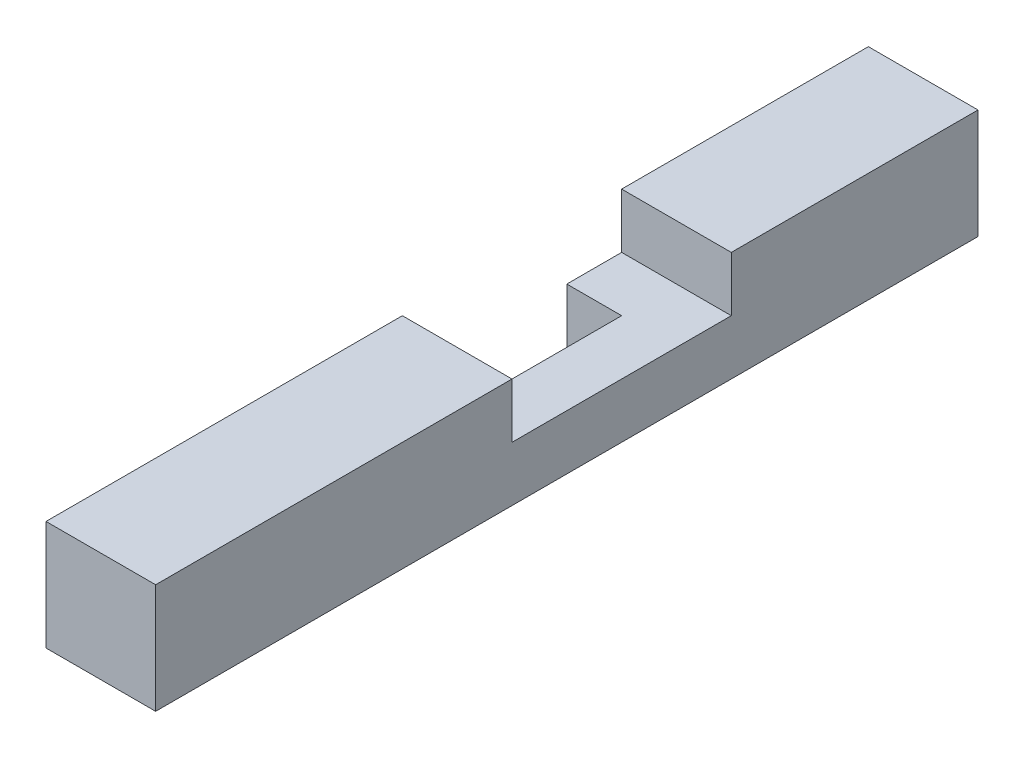
ISO-10303-21;
HEADER;
FILE_DESCRIPTION(('STEP AP214'),'2;1');
FILE_NAME('part.step','',(''),(''),'','','');
FILE_SCHEMA(('AUTOMOTIVE_DESIGN { 1 0 10303 214 1 1 1 1 }'));
ENDSEC;
DATA;
#1=APPLICATION_CONTEXT('core data for automotive mechanical design processes');
#2=APPLICATION_PROTOCOL_DEFINITION('international standard','automotive_design',2000,#1);
#3=PRODUCT_CONTEXT('',#1,'mechanical');
#4=PRODUCT('Part','Part','',(#3));
#5=PRODUCT_RELATED_PRODUCT_CATEGORY('part','',(#4));
#6=PRODUCT_DEFINITION_FORMATION('','',#4);
#7=PRODUCT_DEFINITION_CONTEXT('part definition',#1,'design');
#8=PRODUCT_DEFINITION('design','',#6,#7);
#9=PRODUCT_DEFINITION_SHAPE('','',#8);
#10=(LENGTH_UNIT() NAMED_UNIT(*) SI_UNIT(.MILLI.,.METRE.));
#11=(NAMED_UNIT(*) PLANE_ANGLE_UNIT() SI_UNIT($,.RADIAN.));
#12=(NAMED_UNIT(*) SI_UNIT($,.STERADIAN.) SOLID_ANGLE_UNIT());
#13=UNCERTAINTY_MEASURE_WITH_UNIT(LENGTH_MEASURE(1.E-05),#10,'distance_accuracy_value','');
#14=(GEOMETRIC_REPRESENTATION_CONTEXT(3) GLOBAL_UNCERTAINTY_ASSIGNED_CONTEXT((#13)) GLOBAL_UNIT_ASSIGNED_CONTEXT((#10,
#11,#12)) REPRESENTATION_CONTEXT('',''));
#15=CARTESIAN_POINT('',(0.,0.,0.));
#16=DIRECTION('',(0.,0.,1.));
#17=DIRECTION('',(1.,0.,0.));
#18=AXIS2_PLACEMENT_3D('',#15,#16,#17);
#19=CARTESIAN_POINT('',(-2.,2.,30.));
#20=DIRECTION('',(1.,0.,0.));
#21=DIRECTION('',(0.,1.,0.));
#22=AXIS2_PLACEMENT_3D('',#19,#20,#21);
#23=PLANE('',#22);
#24=DIRECTION('',(0.,-1.,0.));
#25=VECTOR('',#24,1.);
#26=CARTESIAN_POINT('',(-2.,0.,15.));
#27=LINE('',#26,#25);
#28=CARTESIAN_POINT('',(-2.,0.,15.));
#29=VERTEX_POINT('',#28);
#30=CARTESIAN_POINT('',(-2.,-2.,15.));
#31=VERTEX_POINT('',#30);
#32=EDGE_CURVE('E142',#29,#31,#27,.T.);
#33=ORIENTED_EDGE('',*,*,#32,.T.);
#34=DIRECTION('',(0.,0.,-1.));
#35=VECTOR('',#34,1.);
#36=CARTESIAN_POINT('',(-2.,-2.,30.));
#37=LINE('',#36,#35);
#38=CARTESIAN_POINT('',(-2.,-2.,30.));
#39=VERTEX_POINT('',#38);
#40=EDGE_CURVE('E11',#39,#31,#37,.T.);
#41=ORIENTED_EDGE('',*,*,#40,.F.);
#42=DIRECTION('',(0.,-1.,0.));
#43=VECTOR('',#42,1.);
#44=CARTESIAN_POINT('',(-2.,2.,30.));
#45=LINE('',#44,#43);
#46=CARTESIAN_POINT('',(-2.,2.,30.));
#47=VERTEX_POINT('',#46);
#48=EDGE_CURVE('E184',#47,#39,#45,.T.);
#49=ORIENTED_EDGE('',*,*,#48,.F.);
#50=DIRECTION('',(0.,0.,-1.));
#51=VECTOR('',#50,1.);
#52=CARTESIAN_POINT('',(-2.,2.,30.));
#53=LINE('',#52,#51);
#54=CARTESIAN_POINT('',(-2.,2.,17.));
#55=VERTEX_POINT('',#54);
#56=EDGE_CURVE('E207',#47,#55,#53,.T.);
#57=ORIENTED_EDGE('',*,*,#56,.T.);
#58=DIRECTION('',(0.,1.,0.));
#59=VECTOR('',#58,1.);
#60=CARTESIAN_POINT('',(-2.,2.,17.));
#61=LINE('',#60,#59);
#62=CARTESIAN_POINT('',(-2.,0.,17.));
#63=VERTEX_POINT('',#62);
#64=EDGE_CURVE('E58',#63,#55,#61,.T.);
#65=ORIENTED_EDGE('',*,*,#64,.F.);
#66=DIRECTION('',(0.,0.,1.));
#67=VECTOR('',#66,1.);
#68=CARTESIAN_POINT('',(-2.,0.,9.));
#69=LINE('',#68,#67);
#70=EDGE_CURVE('E171',#29,#63,#69,.T.);
#71=ORIENTED_EDGE('',*,*,#70,.F.);
#72=EDGE_LOOP('',(#33,#41,#49,#57,#65,#71));
#73=FACE_BOUND('',#72,.T.);
#74=ADVANCED_FACE('F35',(#73),#23,.F.);
#75=CARTESIAN_POINT('',(-2.,2.,30.));
#76=DIRECTION('',(0.,1.,0.));
#77=DIRECTION('',(0.,0.,1.));
#78=AXIS2_PLACEMENT_3D('',#75,#76,#77);
#79=PLANE('',#78);
#80=DIRECTION('',(-1.,0.,0.));
#81=VECTOR('',#80,1.);
#82=CARTESIAN_POINT('',(2.,2.,9.));
#83=LINE('',#82,#81);
#84=CARTESIAN_POINT('',(2.,2.,9.));
#85=VERTEX_POINT('',#84);
#86=CARTESIAN_POINT('',(-2.,2.,9.));
#87=VERTEX_POINT('',#86);
#88=EDGE_CURVE('E176',#85,#87,#83,.T.);
#89=ORIENTED_EDGE('',*,*,#88,.F.);
#90=DIRECTION('',(0.,0.,-1.));
#91=VECTOR('',#90,1.);
#92=CARTESIAN_POINT('',(2.,2.,30.));
#93=LINE('',#92,#91);
#94=CARTESIAN_POINT('',(2.,2.,0.));
#95=VERTEX_POINT('',#94);
#96=EDGE_CURVE('E210',#85,#95,#93,.T.);
#97=ORIENTED_EDGE('',*,*,#96,.T.);
#98=DIRECTION('',(1.,0.,0.));
#99=VECTOR('',#98,1.);
#100=CARTESIAN_POINT('',(-2.,2.,0.));
#101=LINE('',#100,#99);
#102=CARTESIAN_POINT('',(-2.,2.,0.));
#103=VERTEX_POINT('',#102);
#104=EDGE_CURVE('E188',#103,#95,#101,.T.);
#105=ORIENTED_EDGE('',*,*,#104,.F.);
#106=EDGE_CURVE('E196',#87,#103,#53,.T.);
#107=ORIENTED_EDGE('',*,*,#106,.F.);
#108=EDGE_LOOP('',(#89,#97,#105,#107));
#109=FACE_BOUND('',#108,.T.);
#110=ADVANCED_FACE('F228',(#109),#79,.T.);
#111=CARTESIAN_POINT('',(-2.,-2.,11.));
#112=VERTEX_POINT('',#111);
#113=CARTESIAN_POINT('',(-2.,-2.,0.));
#114=VERTEX_POINT('',#113);
#115=EDGE_CURVE('E43',#112,#114,#37,.T.);
#116=ORIENTED_EDGE('',*,*,#115,.F.);
#117=DIRECTION('',(0.,-1.,0.));
#118=VECTOR('',#117,1.);
#119=CARTESIAN_POINT('',(-2.,0.,11.));
#120=LINE('',#119,#118);
#121=CARTESIAN_POINT('',(-2.,0.,11.));
#122=VERTEX_POINT('',#121);
#123=EDGE_CURVE('E131',#122,#112,#120,.T.);
#124=ORIENTED_EDGE('',*,*,#123,.F.);
#125=CARTESIAN_POINT('',(-2.,0.,9.));
#126=VERTEX_POINT('',#125);
#127=EDGE_CURVE('E172',#126,#122,#69,.T.);
#128=ORIENTED_EDGE('',*,*,#127,.F.);
#129=DIRECTION('',(0.,-1.,0.));
#130=VECTOR('',#129,1.);
#131=CARTESIAN_POINT('',(-2.,2.,9.));
#132=LINE('',#131,#130);
#133=EDGE_CURVE('E154',#87,#126,#132,.T.);
#134=ORIENTED_EDGE('',*,*,#133,.F.);
#135=ORIENTED_EDGE('',*,*,#106,.T.);
#136=DIRECTION('',(0.,-1.,0.));
#137=VECTOR('',#136,1.);
#138=CARTESIAN_POINT('',(-2.,2.,0.));
#139=LINE('',#138,#137);
#140=EDGE_CURVE('E178',#103,#114,#139,.T.);
#141=ORIENTED_EDGE('',*,*,#140,.T.);
#142=EDGE_LOOP('',(#116,#124,#128,#134,#135,#141));
#143=FACE_BOUND('',#142,.T.);
#144=ADVANCED_FACE('F37',(#143),#23,.F.);
#145=CARTESIAN_POINT('',(-2.,-2.,30.));
#146=DIRECTION('',(0.,1.,0.));
#147=DIRECTION('',(0.,0.,1.));
#148=AXIS2_PLACEMENT_3D('',#145,#146,#147);
#149=PLANE('',#148);
#150=DIRECTION('',(0.,0.,1.));
#151=VECTOR('',#150,1.);
#152=CARTESIAN_POINT('',(0.,-2.,11.));
#153=LINE('',#152,#151);
#154=CARTESIAN_POINT('',(0.,-2.,11.));
#155=VERTEX_POINT('',#154);
#156=CARTESIAN_POINT('',(0.,-2.,15.));
#157=VERTEX_POINT('',#156);
#158=EDGE_CURVE('E139',#155,#157,#153,.T.);
#159=ORIENTED_EDGE('',*,*,#158,.F.);
#160=DIRECTION('',(-1.,0.,0.));
#161=VECTOR('',#160,1.);
#162=CARTESIAN_POINT('',(0.,-2.,11.));
#163=LINE('',#162,#161);
#164=EDGE_CURVE('E125',#155,#112,#163,.T.);
#165=ORIENTED_EDGE('',*,*,#164,.T.);
#166=ORIENTED_EDGE('',*,*,#115,.T.);
#167=DIRECTION('',(1.,0.,0.));
#168=VECTOR('',#167,1.);
#169=CARTESIAN_POINT('',(-2.,-2.,0.));
#170=LINE('',#169,#168);
#171=CARTESIAN_POINT('',(2.,-2.,0.));
#172=VERTEX_POINT('',#171);
#173=EDGE_CURVE('E199',#114,#172,#170,.T.);
#174=ORIENTED_EDGE('',*,*,#173,.T.);
#175=DIRECTION('',(0.,0.,-1.));
#176=VECTOR('',#175,1.);
#177=CARTESIAN_POINT('',(2.,-2.,30.));
#178=LINE('',#177,#176);
#179=CARTESIAN_POINT('',(2.,-2.,30.));
#180=VERTEX_POINT('',#179);
#181=EDGE_CURVE('E213',#180,#172,#178,.T.);
#182=ORIENTED_EDGE('',*,*,#181,.F.);
#183=DIRECTION('',(1.,0.,0.));
#184=VECTOR('',#183,1.);
#185=CARTESIAN_POINT('',(-2.,-2.,30.));
#186=LINE('',#185,#184);
#187=EDGE_CURVE('E187',#39,#180,#186,.T.);
#188=ORIENTED_EDGE('',*,*,#187,.F.);
#189=ORIENTED_EDGE('',*,*,#40,.T.);
#190=DIRECTION('',(-1.,0.,0.));
#191=VECTOR('',#190,1.);
#192=CARTESIAN_POINT('',(0.,-2.,15.));
#193=LINE('',#192,#191);
#194=EDGE_CURVE('E135',#157,#31,#193,.T.);
#195=ORIENTED_EDGE('',*,*,#194,.F.);
#196=EDGE_LOOP('',(#159,#165,#166,#174,#182,#188,#189,#195));
#197=FACE_BOUND('',#196,.T.);
#198=ADVANCED_FACE('F144',(#197),#149,.F.);
#199=CARTESIAN_POINT('',(2.,2.,30.));
#200=DIRECTION('',(1.,0.,0.));
#201=DIRECTION('',(0.,1.,0.));
#202=AXIS2_PLACEMENT_3D('',#199,#200,#201);
#203=PLANE('',#202);
#204=DIRECTION('',(0.,-1.,0.));
#205=VECTOR('',#204,1.);
#206=CARTESIAN_POINT('',(2.,2.,9.));
#207=LINE('',#206,#205);
#208=CARTESIAN_POINT('',(2.,0.,9.));
#209=VERTEX_POINT('',#208);
#210=EDGE_CURVE('E159',#85,#209,#207,.T.);
#211=ORIENTED_EDGE('',*,*,#210,.T.);
#212=DIRECTION('',(0.,0.,1.));
#213=VECTOR('',#212,1.);
#214=CARTESIAN_POINT('',(2.,0.,9.));
#215=LINE('',#214,#213);
#216=CARTESIAN_POINT('',(2.,0.,17.));
#217=VERTEX_POINT('',#216);
#218=EDGE_CURVE('E162',#209,#217,#215,.T.);
#219=ORIENTED_EDGE('',*,*,#218,.T.);
#220=DIRECTION('',(0.,1.,0.));
#221=VECTOR('',#220,1.);
#222=CARTESIAN_POINT('',(2.,2.,17.));
#223=LINE('',#222,#221);
#224=CARTESIAN_POINT('',(2.,2.,17.));
#225=VERTEX_POINT('',#224);
#226=EDGE_CURVE('E165',#217,#225,#223,.T.);
#227=ORIENTED_EDGE('',*,*,#226,.T.);
#228=CARTESIAN_POINT('',(2.,2.,30.));
#229=VERTEX_POINT('',#228);
#230=EDGE_CURVE('E211',#229,#225,#93,.T.);
#231=ORIENTED_EDGE('',*,*,#230,.F.);
#232=DIRECTION('',(0.,-1.,0.));
#233=VECTOR('',#232,1.);
#234=CARTESIAN_POINT('',(2.,2.,30.));
#235=LINE('',#234,#233);
#236=EDGE_CURVE('E190',#229,#180,#235,.T.);
#237=ORIENTED_EDGE('',*,*,#236,.T.);
#238=ORIENTED_EDGE('',*,*,#181,.T.);
#239=DIRECTION('',(0.,-1.,0.));
#240=VECTOR('',#239,1.);
#241=CARTESIAN_POINT('',(2.,2.,0.));
#242=LINE('',#241,#240);
#243=EDGE_CURVE('E202',#95,#172,#242,.T.);
#244=ORIENTED_EDGE('',*,*,#243,.F.);
#245=ORIENTED_EDGE('',*,*,#96,.F.);
#246=EDGE_LOOP('',(#211,#219,#227,#231,#237,#238,#244,#245));
#247=FACE_BOUND('',#246,.T.);
#248=ADVANCED_FACE('F230',(#247),#203,.T.);
#249=DIRECTION('',(-1.,0.,0.));
#250=VECTOR('',#249,1.);
#251=CARTESIAN_POINT('',(2.,2.,17.));
#252=LINE('',#251,#250);
#253=EDGE_CURVE('E179',#225,#55,#252,.T.);
#254=ORIENTED_EDGE('',*,*,#253,.T.);
#255=ORIENTED_EDGE('',*,*,#56,.F.);
#256=DIRECTION('',(1.,0.,0.));
#257=VECTOR('',#256,1.);
#258=CARTESIAN_POINT('',(-2.,2.,30.));
#259=LINE('',#258,#257);
#260=EDGE_CURVE('E193',#47,#229,#259,.T.);
#261=ORIENTED_EDGE('',*,*,#260,.T.);
#262=ORIENTED_EDGE('',*,*,#230,.T.);
#263=EDGE_LOOP('',(#254,#255,#261,#262));
#264=FACE_BOUND('',#263,.T.);
#265=ADVANCED_FACE('F232',(#264),#79,.T.);
#266=CARTESIAN_POINT('',(0.,0.,30.));
#267=DIRECTION('',(0.,0.,1.));
#268=DIRECTION('',(1.,0.,0.));
#269=AXIS2_PLACEMENT_3D('',#266,#267,#268);
#270=PLANE('',#269);
#271=ORIENTED_EDGE('',*,*,#48,.T.);
#272=ORIENTED_EDGE('',*,*,#187,.T.);
#273=ORIENTED_EDGE('',*,*,#236,.F.);
#274=ORIENTED_EDGE('',*,*,#260,.F.);
#275=EDGE_LOOP('',(#271,#272,#273,#274));
#276=FACE_BOUND('',#275,.T.);
#277=ADVANCED_FACE('F238',(#276),#270,.T.);
#278=CARTESIAN_POINT('',(0.,0.,0.));
#279=DIRECTION('',(0.,0.,1.));
#280=DIRECTION('',(1.,0.,0.));
#281=AXIS2_PLACEMENT_3D('',#278,#279,#280);
#282=PLANE('',#281);
#283=ORIENTED_EDGE('',*,*,#140,.F.);
#284=ORIENTED_EDGE('',*,*,#104,.T.);
#285=ORIENTED_EDGE('',*,*,#243,.T.);
#286=ORIENTED_EDGE('',*,*,#173,.F.);
#287=EDGE_LOOP('',(#283,#284,#285,#286));
#288=FACE_BOUND('',#287,.T.);
#289=ADVANCED_FACE('F221',(#288),#282,.F.);
#290=CARTESIAN_POINT('',(2.,2.,9.));
#291=DIRECTION('',(0.,0.,-1.));
#292=DIRECTION('',(-1.,0.,0.));
#293=AXIS2_PLACEMENT_3D('',#290,#291,#292);
#294=PLANE('',#293);
#295=ORIENTED_EDGE('',*,*,#133,.T.);
#296=DIRECTION('',(-1.,0.,0.));
#297=VECTOR('',#296,1.);
#298=CARTESIAN_POINT('',(2.,0.,9.));
#299=LINE('',#298,#297);
#300=EDGE_CURVE('E168',#209,#126,#299,.T.);
#301=ORIENTED_EDGE('',*,*,#300,.F.);
#302=ORIENTED_EDGE('',*,*,#210,.F.);
#303=ORIENTED_EDGE('',*,*,#88,.T.);
#304=EDGE_LOOP('',(#295,#301,#302,#303));
#305=FACE_BOUND('',#304,.T.);
#306=ADVANCED_FACE('F294',(#305),#294,.F.);
#307=CARTESIAN_POINT('',(2.,2.,17.));
#308=DIRECTION('',(0.,0.,1.));
#309=DIRECTION('',(1.,0.,0.));
#310=AXIS2_PLACEMENT_3D('',#307,#308,#309);
#311=PLANE('',#310);
#312=ORIENTED_EDGE('',*,*,#64,.T.);
#313=ORIENTED_EDGE('',*,*,#253,.F.);
#314=ORIENTED_EDGE('',*,*,#226,.F.);
#315=DIRECTION('',(-1.,0.,0.));
#316=VECTOR('',#315,1.);
#317=CARTESIAN_POINT('',(2.,0.,17.));
#318=LINE('',#317,#316);
#319=EDGE_CURVE('E181',#217,#63,#318,.T.);
#320=ORIENTED_EDGE('',*,*,#319,.T.);
#321=EDGE_LOOP('',(#312,#313,#314,#320));
#322=FACE_BOUND('',#321,.T.);
#323=ADVANCED_FACE('F261',(#322),#311,.F.);
#324=CARTESIAN_POINT('',(2.,0.,9.));
#325=DIRECTION('',(0.,-1.,0.));
#326=DIRECTION('',(1.,0.,0.));
#327=AXIS2_PLACEMENT_3D('',#324,#325,#326);
#328=PLANE('',#327);
#329=ORIENTED_EDGE('',*,*,#127,.T.);
#330=DIRECTION('',(-1.,0.,0.));
#331=VECTOR('',#330,1.);
#332=CARTESIAN_POINT('',(0.,0.,11.));
#333=LINE('',#332,#331);
#334=CARTESIAN_POINT('',(0.,0.,11.));
#335=VERTEX_POINT('',#334);
#336=EDGE_CURVE('E152',#335,#122,#333,.T.);
#337=ORIENTED_EDGE('',*,*,#336,.F.);
#338=DIRECTION('',(0.,0.,1.));
#339=VECTOR('',#338,1.);
#340=CARTESIAN_POINT('',(0.,0.,11.));
#341=LINE('',#340,#339);
#342=CARTESIAN_POINT('',(0.,0.,15.));
#343=VERTEX_POINT('',#342);
#344=EDGE_CURVE('E136',#335,#343,#341,.T.);
#345=ORIENTED_EDGE('',*,*,#344,.T.);
#346=DIRECTION('',(-1.,0.,0.));
#347=VECTOR('',#346,1.);
#348=CARTESIAN_POINT('',(0.,0.,15.));
#349=LINE('',#348,#347);
#350=EDGE_CURVE('E155',#343,#29,#349,.T.);
#351=ORIENTED_EDGE('',*,*,#350,.T.);
#352=ORIENTED_EDGE('',*,*,#70,.T.);
#353=ORIENTED_EDGE('',*,*,#319,.F.);
#354=ORIENTED_EDGE('',*,*,#218,.F.);
#355=ORIENTED_EDGE('',*,*,#300,.T.);
#356=EDGE_LOOP('',(#329,#337,#345,#351,#352,#353,#354,#355));
#357=FACE_BOUND('',#356,.T.);
#358=ADVANCED_FACE('F257',(#357),#328,.F.);
#359=CARTESIAN_POINT('',(0.,0.,11.));
#360=DIRECTION('',(0.,0.,-1.));
#361=DIRECTION('',(-1.,0.,0.));
#362=AXIS2_PLACEMENT_3D('',#359,#360,#361);
#363=PLANE('',#362);
#364=ORIENTED_EDGE('',*,*,#123,.T.);
#365=ORIENTED_EDGE('',*,*,#164,.F.);
#366=DIRECTION('',(0.,-1.,0.));
#367=VECTOR('',#366,1.);
#368=CARTESIAN_POINT('',(0.,0.,11.));
#369=LINE('',#368,#367);
#370=EDGE_CURVE('E128',#335,#155,#369,.T.);
#371=ORIENTED_EDGE('',*,*,#370,.F.);
#372=ORIENTED_EDGE('',*,*,#336,.T.);
#373=EDGE_LOOP('',(#364,#365,#371,#372));
#374=FACE_BOUND('',#373,.T.);
#375=ADVANCED_FACE('F127',(#374),#363,.F.);
#376=CARTESIAN_POINT('',(0.,0.,15.));
#377=DIRECTION('',(0.,0.,-1.));
#378=DIRECTION('',(-1.,0.,0.));
#379=AXIS2_PLACEMENT_3D('',#376,#377,#378);
#380=PLANE('',#379);
#381=ORIENTED_EDGE('',*,*,#32,.F.);
#382=ORIENTED_EDGE('',*,*,#350,.F.);
#383=DIRECTION('',(0.,-1.,0.));
#384=VECTOR('',#383,1.);
#385=CARTESIAN_POINT('',(0.,0.,15.));
#386=LINE('',#385,#384);
#387=EDGE_CURVE('E50',#343,#157,#386,.T.);
#388=ORIENTED_EDGE('',*,*,#387,.T.);
#389=ORIENTED_EDGE('',*,*,#194,.T.);
#390=EDGE_LOOP('',(#381,#382,#388,#389));
#391=FACE_BOUND('',#390,.T.);
#392=ADVANCED_FACE('F272',(#391),#380,.T.);
#393=CARTESIAN_POINT('',(0.,0.,0.));
#394=DIRECTION('',(-1.,0.,0.));
#395=DIRECTION('',(0.,-1.,0.));
#396=AXIS2_PLACEMENT_3D('',#393,#394,#395);
#397=PLANE('',#396);
#398=ORIENTED_EDGE('',*,*,#370,.T.);
#399=ORIENTED_EDGE('',*,*,#158,.T.);
#400=ORIENTED_EDGE('',*,*,#387,.F.);
#401=ORIENTED_EDGE('',*,*,#344,.F.);
#402=EDGE_LOOP('',(#398,#399,#400,#401));
#403=FACE_BOUND('',#402,.T.);
#404=ADVANCED_FACE('F138',(#403),#397,.T.);
#405=CLOSED_SHELL('',(#74,#110,#144,#198,#248,#265,#277,#289,#306,#323,#358,#375,#392,#404));
#406=MANIFOLD_SOLID_BREP('B2',#405);
#407=ADVANCED_BREP_SHAPE_REPRESENTATION('',(#18,#406),#14);
#408=SHAPE_DEFINITION_REPRESENTATION(#9,#407);
ENDSEC;
END-ISO-10303-21;
